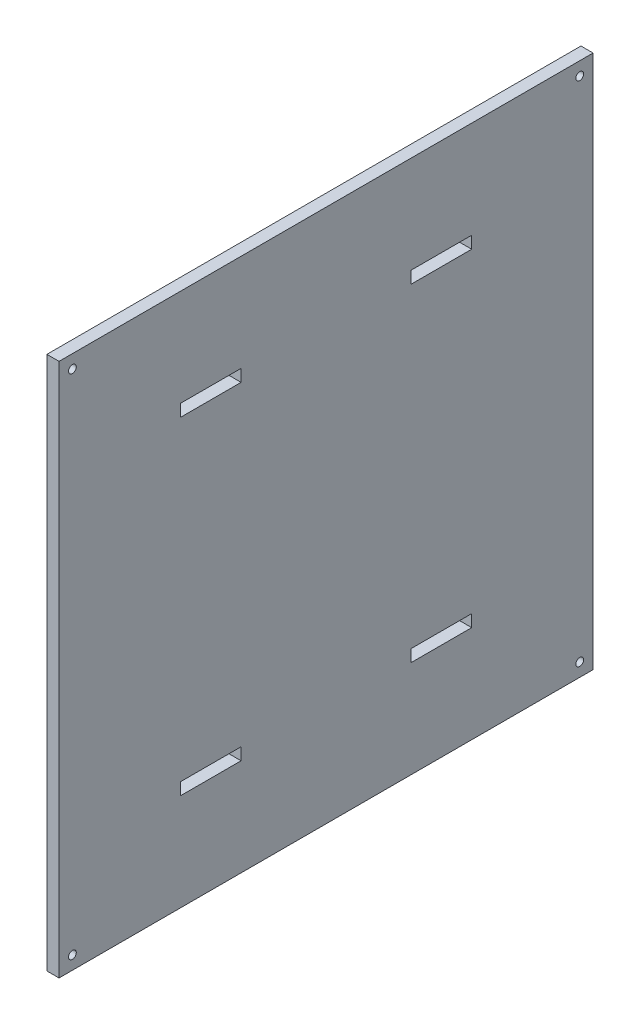
ISO-10303-21;
HEADER;
FILE_DESCRIPTION(('STEP AP214'),'2;1');
FILE_NAME('part.step','',(''),(''),'','','');
FILE_SCHEMA(('AUTOMOTIVE_DESIGN { 1 0 10303 214 1 1 1 1 }'));
ENDSEC;
DATA;
#1=APPLICATION_CONTEXT('core data for automotive mechanical design processes');
#2=APPLICATION_PROTOCOL_DEFINITION('international standard','automotive_design',2000,#1);
#3=PRODUCT_CONTEXT('',#1,'mechanical');
#4=PRODUCT('Part','Part','',(#3));
#5=PRODUCT_RELATED_PRODUCT_CATEGORY('part','',(#4));
#6=PRODUCT_DEFINITION_FORMATION('','',#4);
#7=PRODUCT_DEFINITION_CONTEXT('part definition',#1,'design');
#8=PRODUCT_DEFINITION('design','',#6,#7);
#9=PRODUCT_DEFINITION_SHAPE('','',#8);
#10=(LENGTH_UNIT() NAMED_UNIT(*) SI_UNIT(.MILLI.,.METRE.));
#11=(NAMED_UNIT(*) PLANE_ANGLE_UNIT() SI_UNIT($,.RADIAN.));
#12=(NAMED_UNIT(*) SI_UNIT($,.STERADIAN.) SOLID_ANGLE_UNIT());
#13=UNCERTAINTY_MEASURE_WITH_UNIT(LENGTH_MEASURE(1.E-05),#10,'distance_accuracy_value','');
#14=(GEOMETRIC_REPRESENTATION_CONTEXT(3) GLOBAL_UNCERTAINTY_ASSIGNED_CONTEXT((#13)) GLOBAL_UNIT_ASSIGNED_CONTEXT((#10,
#11,#12)) REPRESENTATION_CONTEXT('',''));
#15=CARTESIAN_POINT('',(0.,0.,0.));
#16=DIRECTION('',(0.,0.,1.));
#17=DIRECTION('',(1.,0.,0.));
#18=AXIS2_PLACEMENT_3D('',#15,#16,#17);
#19=CARTESIAN_POINT('',(5.,0.,0.));
#20=DIRECTION('',(1.,0.,0.));
#21=DIRECTION('',(0.,0.,-1.));
#22=AXIS2_PLACEMENT_3D('',#19,#20,#21);
#23=PLANE('',#22);
#24=CARTESIAN_POINT('',(5.,5.49999999999997,214.5));
#25=DIRECTION('',(1.,0.,0.));
#26=DIRECTION('',(0.,0.,-1.));
#27=AXIS2_PLACEMENT_3D('',#24,#25,#26);
#28=CIRCLE('',#27,1.59999999999999);
#29=CARTESIAN_POINT('',(5.,5.49999999999997,212.9));
#30=VERTEX_POINT('',#29);
#31=EDGE_CURVE('E575',#30,#30,#28,.T.);
#32=ORIENTED_EDGE('',*,*,#31,.F.);
#33=EDGE_LOOP('',(#32));
#34=FACE_BOUND('',#33,.T.);
#35=CARTESIAN_POINT('',(5.,214.5,214.5));
#36=DIRECTION('',(1.,0.,0.));
#37=DIRECTION('',(0.,0.,-1.));
#38=AXIS2_PLACEMENT_3D('',#35,#36,#37);
#39=CIRCLE('',#38,1.59999999999999);
#40=CARTESIAN_POINT('',(5.,214.5,212.9));
#41=VERTEX_POINT('',#40);
#42=EDGE_CURVE('E200',#41,#41,#39,.T.);
#43=ORIENTED_EDGE('',*,*,#42,.F.);
#44=EDGE_LOOP('',(#43));
#45=FACE_BOUND('',#44,.T.);
#46=DIRECTION('',(0.,1.,0.));
#47=VECTOR('',#46,1.);
#48=CARTESIAN_POINT('',(5.,0.,0.));
#49=LINE('',#48,#47);
#50=CARTESIAN_POINT('',(5.,0.,0.));
#51=VERTEX_POINT('',#50);
#52=CARTESIAN_POINT('',(5.,220.,0.));
#53=VERTEX_POINT('',#52);
#54=EDGE_CURVE('E303',#51,#53,#49,.T.);
#55=ORIENTED_EDGE('',*,*,#54,.T.);
#56=DIRECTION('',(0.,0.,1.));
#57=VECTOR('',#56,1.);
#58=CARTESIAN_POINT('',(5.,220.,0.));
#59=LINE('',#58,#57);
#60=CARTESIAN_POINT('',(5.,220.,220.));
#61=VERTEX_POINT('',#60);
#62=EDGE_CURVE('E306',#53,#61,#59,.T.);
#63=ORIENTED_EDGE('',*,*,#62,.T.);
#64=DIRECTION('',(0.,-1.,0.));
#65=VECTOR('',#64,1.);
#66=CARTESIAN_POINT('',(5.,0.,220.));
#67=LINE('',#66,#65);
#68=CARTESIAN_POINT('',(5.,0.,220.));
#69=VERTEX_POINT('',#68);
#70=EDGE_CURVE('E309',#61,#69,#67,.T.);
#71=ORIENTED_EDGE('',*,*,#70,.T.);
#72=DIRECTION('',(0.,0.,-1.));
#73=VECTOR('',#72,1.);
#74=CARTESIAN_POINT('',(5.,0.,0.));
#75=LINE('',#74,#73);
#76=EDGE_CURVE('E311',#69,#51,#75,.T.);
#77=ORIENTED_EDGE('',*,*,#76,.T.);
#78=EDGE_LOOP('',(#55,#63,#71,#77));
#79=FACE_BOUND('',#78,.T.);
#80=DIRECTION('',(0.,0.,-1.));
#81=VECTOR('',#80,1.);
#82=CARTESIAN_POINT('',(5.,40.,170.));
#83=LINE('',#82,#81);
#84=CARTESIAN_POINT('',(5.,40.,170.));
#85=VERTEX_POINT('',#84);
#86=CARTESIAN_POINT('',(5.,40.,145.));
#87=VERTEX_POINT('',#86);
#88=EDGE_CURVE('E274',#85,#87,#83,.T.);
#89=ORIENTED_EDGE('',*,*,#88,.F.);
#90=DIRECTION('',(0.,-1.,0.));
#91=VECTOR('',#90,1.);
#92=CARTESIAN_POINT('',(5.,44.9999999999999,170.));
#93=LINE('',#92,#91);
#94=CARTESIAN_POINT('',(5.,44.9999999999999,170.));
#95=VERTEX_POINT('',#94);
#96=EDGE_CURVE('E272',#95,#85,#93,.T.);
#97=ORIENTED_EDGE('',*,*,#96,.F.);
#98=DIRECTION('',(0.,0.,1.));
#99=VECTOR('',#98,1.);
#100=CARTESIAN_POINT('',(5.,44.9999999999999,170.));
#101=LINE('',#100,#99);
#102=CARTESIAN_POINT('',(5.,45.,145.));
#103=VERTEX_POINT('',#102);
#104=EDGE_CURVE('E280',#103,#95,#101,.T.);
#105=ORIENTED_EDGE('',*,*,#104,.F.);
#106=DIRECTION('',(0.,1.,0.));
#107=VECTOR('',#106,1.);
#108=CARTESIAN_POINT('',(5.,45.,145.));
#109=LINE('',#108,#107);
#110=EDGE_CURVE('E277',#87,#103,#109,.T.);
#111=ORIENTED_EDGE('',*,*,#110,.F.);
#112=EDGE_LOOP('',(#89,#97,#105,#111));
#113=FACE_BOUND('',#112,.T.);
#114=DIRECTION('',(0.,0.,-1.));
#115=VECTOR('',#114,1.);
#116=CARTESIAN_POINT('',(5.,40.,75.));
#117=LINE('',#116,#115);
#118=CARTESIAN_POINT('',(5.,40.,75.));
#119=VERTEX_POINT('',#118);
#120=CARTESIAN_POINT('',(5.,40.,50.));
#121=VERTEX_POINT('',#120);
#122=EDGE_CURVE('E243',#119,#121,#117,.T.);
#123=ORIENTED_EDGE('',*,*,#122,.F.);
#124=DIRECTION('',(0.,-1.,0.));
#125=VECTOR('',#124,1.);
#126=CARTESIAN_POINT('',(5.,45.,75.));
#127=LINE('',#126,#125);
#128=CARTESIAN_POINT('',(5.,45.,75.));
#129=VERTEX_POINT('',#128);
#130=EDGE_CURVE('E241',#129,#119,#127,.T.);
#131=ORIENTED_EDGE('',*,*,#130,.F.);
#132=DIRECTION('',(0.,0.,1.));
#133=VECTOR('',#132,1.);
#134=CARTESIAN_POINT('',(5.,45.,75.));
#135=LINE('',#134,#133);
#136=CARTESIAN_POINT('',(5.,45.,50.));
#137=VERTEX_POINT('',#136);
#138=EDGE_CURVE('E249',#137,#129,#135,.T.);
#139=ORIENTED_EDGE('',*,*,#138,.F.);
#140=DIRECTION('',(0.,1.,0.));
#141=VECTOR('',#140,1.);
#142=CARTESIAN_POINT('',(5.,45.,50.));
#143=LINE('',#142,#141);
#144=EDGE_CURVE('E246',#121,#137,#143,.T.);
#145=ORIENTED_EDGE('',*,*,#144,.F.);
#146=EDGE_LOOP('',(#123,#131,#139,#145));
#147=FACE_BOUND('',#146,.T.);
#148=DIRECTION('',(0.,0.,-1.));
#149=VECTOR('',#148,1.);
#150=CARTESIAN_POINT('',(5.,175.,170.));
#151=LINE('',#150,#149);
#152=CARTESIAN_POINT('',(5.,175.,170.));
#153=VERTEX_POINT('',#152);
#154=CARTESIAN_POINT('',(5.,175.,145.));
#155=VERTEX_POINT('',#154);
#156=EDGE_CURVE('E212',#153,#155,#151,.T.);
#157=ORIENTED_EDGE('',*,*,#156,.F.);
#158=DIRECTION('',(0.,-1.,0.));
#159=VECTOR('',#158,1.);
#160=CARTESIAN_POINT('',(5.,180.,170.));
#161=LINE('',#160,#159);
#162=CARTESIAN_POINT('',(5.,180.,170.));
#163=VERTEX_POINT('',#162);
#164=EDGE_CURVE('E210',#163,#153,#161,.T.);
#165=ORIENTED_EDGE('',*,*,#164,.F.);
#166=DIRECTION('',(0.,0.,1.));
#167=VECTOR('',#166,1.);
#168=CARTESIAN_POINT('',(5.,180.,170.));
#169=LINE('',#168,#167);
#170=CARTESIAN_POINT('',(5.,180.,145.));
#171=VERTEX_POINT('',#170);
#172=EDGE_CURVE('E218',#171,#163,#169,.T.);
#173=ORIENTED_EDGE('',*,*,#172,.F.);
#174=DIRECTION('',(0.,1.,0.));
#175=VECTOR('',#174,1.);
#176=CARTESIAN_POINT('',(5.,180.,145.));
#177=LINE('',#176,#175);
#178=EDGE_CURVE('E215',#155,#171,#177,.T.);
#179=ORIENTED_EDGE('',*,*,#178,.F.);
#180=EDGE_LOOP('',(#157,#165,#173,#179));
#181=FACE_BOUND('',#180,.T.);
#182=DIRECTION('',(0.,0.,-1.));
#183=VECTOR('',#182,1.);
#184=CARTESIAN_POINT('',(5.,175.,75.));
#185=LINE('',#184,#183);
#186=CARTESIAN_POINT('',(5.,175.,75.));
#187=VERTEX_POINT('',#186);
#188=CARTESIAN_POINT('',(5.,175.,50.));
#189=VERTEX_POINT('',#188);
#190=EDGE_CURVE('E179',#187,#189,#185,.T.);
#191=ORIENTED_EDGE('',*,*,#190,.F.);
#192=DIRECTION('',(0.,-1.,0.));
#193=VECTOR('',#192,1.);
#194=CARTESIAN_POINT('',(5.,180.,75.));
#195=LINE('',#194,#193);
#196=CARTESIAN_POINT('',(5.,180.,75.));
#197=VERTEX_POINT('',#196);
#198=EDGE_CURVE('E171',#197,#187,#195,.T.);
#199=ORIENTED_EDGE('',*,*,#198,.F.);
#200=DIRECTION('',(0.,0.,1.));
#201=VECTOR('',#200,1.);
#202=CARTESIAN_POINT('',(5.,180.,75.));
#203=LINE('',#202,#201);
#204=CARTESIAN_POINT('',(5.,180.,50.));
#205=VERTEX_POINT('',#204);
#206=EDGE_CURVE('E194',#205,#197,#203,.T.);
#207=ORIENTED_EDGE('',*,*,#206,.F.);
#208=DIRECTION('',(0.,1.,0.));
#209=VECTOR('',#208,1.);
#210=CARTESIAN_POINT('',(5.,180.,50.));
#211=LINE('',#210,#209);
#212=EDGE_CURVE('E192',#189,#205,#211,.T.);
#213=ORIENTED_EDGE('',*,*,#212,.F.);
#214=EDGE_LOOP('',(#191,#199,#207,#213));
#215=FACE_BOUND('',#214,.T.);
#216=CARTESIAN_POINT('',(5.,214.5,5.50000000000006));
#217=DIRECTION('',(1.,0.,0.));
#218=DIRECTION('',(0.,0.,-1.));
#219=AXIS2_PLACEMENT_3D('',#216,#217,#218);
#220=CIRCLE('',#219,1.59999999999999);
#221=CARTESIAN_POINT('',(5.,214.5,3.90000000000007));
#222=VERTEX_POINT('',#221);
#223=EDGE_CURVE('E581',#222,#222,#220,.T.);
#224=ORIENTED_EDGE('',*,*,#223,.F.);
#225=EDGE_LOOP('',(#224));
#226=FACE_BOUND('',#225,.T.);
#227=CARTESIAN_POINT('',(5.,5.50000000000002,5.50000000000001));
#228=DIRECTION('',(1.,0.,0.));
#229=DIRECTION('',(0.,0.,-1.));
#230=AXIS2_PLACEMENT_3D('',#227,#228,#229);
#231=CIRCLE('',#230,1.6);
#232=CARTESIAN_POINT('',(5.,5.50000000000002,3.9));
#233=VERTEX_POINT('',#232);
#234=EDGE_CURVE('E566',#233,#233,#231,.T.);
#235=ORIENTED_EDGE('',*,*,#234,.F.);
#236=EDGE_LOOP('',(#235));
#237=FACE_BOUND('',#236,.T.);
#238=ADVANCED_FACE('F34',(#34,#45,#79,#113,#147,#181,#215,#226,#237),#23,.T.);
#239=CARTESIAN_POINT('',(0.,0.,0.));
#240=DIRECTION('',(1.,0.,0.));
#241=DIRECTION('',(0.,0.,-1.));
#242=AXIS2_PLACEMENT_3D('',#239,#240,#241);
#243=PLANE('',#242);
#244=DIRECTION('',(0.,-1.,0.));
#245=VECTOR('',#244,1.);
#246=CARTESIAN_POINT('',(0.,180.,170.));
#247=LINE('',#246,#245);
#248=CARTESIAN_POINT('',(0.,180.,170.));
#249=VERTEX_POINT('',#248);
#250=CARTESIAN_POINT('',(0.,175.,170.));
#251=VERTEX_POINT('',#250);
#252=EDGE_CURVE('E187',#249,#251,#247,.T.);
#253=ORIENTED_EDGE('',*,*,#252,.T.);
#254=DIRECTION('',(0.,0.,-1.));
#255=VECTOR('',#254,1.);
#256=CARTESIAN_POINT('',(0.,175.,170.));
#257=LINE('',#256,#255);
#258=CARTESIAN_POINT('',(0.,175.,145.));
#259=VERTEX_POINT('',#258);
#260=EDGE_CURVE('E223',#251,#259,#257,.T.);
#261=ORIENTED_EDGE('',*,*,#260,.T.);
#262=DIRECTION('',(0.,1.,0.));
#263=VECTOR('',#262,1.);
#264=CARTESIAN_POINT('',(0.,180.,145.));
#265=LINE('',#264,#263);
#266=CARTESIAN_POINT('',(0.,180.,145.));
#267=VERTEX_POINT('',#266);
#268=EDGE_CURVE('E226',#259,#267,#265,.T.);
#269=ORIENTED_EDGE('',*,*,#268,.T.);
#270=DIRECTION('',(0.,0.,1.));
#271=VECTOR('',#270,1.);
#272=CARTESIAN_POINT('',(0.,180.,170.));
#273=LINE('',#272,#271);
#274=EDGE_CURVE('E213',#267,#249,#273,.T.);
#275=ORIENTED_EDGE('',*,*,#274,.T.);
#276=EDGE_LOOP('',(#253,#261,#269,#275));
#277=FACE_BOUND('',#276,.T.);
#278=DIRECTION('',(0.,-1.,0.));
#279=VECTOR('',#278,1.);
#280=CARTESIAN_POINT('',(0.,44.9999999999999,170.));
#281=LINE('',#280,#279);
#282=CARTESIAN_POINT('',(0.,44.9999999999999,170.));
#283=VERTEX_POINT('',#282);
#284=CARTESIAN_POINT('',(0.,40.,170.));
#285=VERTEX_POINT('',#284);
#286=EDGE_CURVE('E271',#283,#285,#281,.T.);
#287=ORIENTED_EDGE('',*,*,#286,.T.);
#288=DIRECTION('',(0.,0.,-1.));
#289=VECTOR('',#288,1.);
#290=CARTESIAN_POINT('',(0.,40.,170.));
#291=LINE('',#290,#289);
#292=CARTESIAN_POINT('',(0.,40.,145.));
#293=VERTEX_POINT('',#292);
#294=EDGE_CURVE('E285',#285,#293,#291,.T.);
#295=ORIENTED_EDGE('',*,*,#294,.T.);
#296=DIRECTION('',(0.,1.,0.));
#297=VECTOR('',#296,1.);
#298=CARTESIAN_POINT('',(0.,45.,145.));
#299=LINE('',#298,#297);
#300=CARTESIAN_POINT('',(0.,45.,145.));
#301=VERTEX_POINT('',#300);
#302=EDGE_CURVE('E288',#293,#301,#299,.T.);
#303=ORIENTED_EDGE('',*,*,#302,.T.);
#304=DIRECTION('',(0.,0.,1.));
#305=VECTOR('',#304,1.);
#306=CARTESIAN_POINT('',(0.,44.9999999999999,170.));
#307=LINE('',#306,#305);
#308=EDGE_CURVE('E275',#301,#283,#307,.T.);
#309=ORIENTED_EDGE('',*,*,#308,.T.);
#310=EDGE_LOOP('',(#287,#295,#303,#309));
#311=FACE_BOUND('',#310,.T.);
#312=DIRECTION('',(0.,1.,0.));
#313=VECTOR('',#312,1.);
#314=CARTESIAN_POINT('',(0.,0.,0.));
#315=LINE('',#314,#313);
#316=CARTESIAN_POINT('',(0.,0.,0.));
#317=VERTEX_POINT('',#316);
#318=CARTESIAN_POINT('',(0.,220.,0.));
#319=VERTEX_POINT('',#318);
#320=EDGE_CURVE('E302',#317,#319,#315,.T.);
#321=ORIENTED_EDGE('',*,*,#320,.F.);
#322=DIRECTION('',(0.,0.,-1.));
#323=VECTOR('',#322,1.);
#324=CARTESIAN_POINT('',(0.,0.,0.));
#325=LINE('',#324,#323);
#326=CARTESIAN_POINT('',(0.,0.,220.));
#327=VERTEX_POINT('',#326);
#328=EDGE_CURVE('E307',#327,#317,#325,.T.);
#329=ORIENTED_EDGE('',*,*,#328,.F.);
#330=DIRECTION('',(0.,-1.,0.));
#331=VECTOR('',#330,1.);
#332=CARTESIAN_POINT('',(0.,0.,220.));
#333=LINE('',#332,#331);
#334=CARTESIAN_POINT('',(0.,220.,220.));
#335=VERTEX_POINT('',#334);
#336=EDGE_CURVE('E318',#335,#327,#333,.T.);
#337=ORIENTED_EDGE('',*,*,#336,.F.);
#338=DIRECTION('',(0.,0.,1.));
#339=VECTOR('',#338,1.);
#340=CARTESIAN_POINT('',(0.,220.,0.));
#341=LINE('',#340,#339);
#342=EDGE_CURVE('E316',#319,#335,#341,.T.);
#343=ORIENTED_EDGE('',*,*,#342,.F.);
#344=EDGE_LOOP('',(#321,#329,#337,#343));
#345=FACE_BOUND('',#344,.T.);
#346=DIRECTION('',(0.,-1.,0.));
#347=VECTOR('',#346,1.);
#348=CARTESIAN_POINT('',(0.,45.,75.));
#349=LINE('',#348,#347);
#350=CARTESIAN_POINT('',(0.,45.,75.));
#351=VERTEX_POINT('',#350);
#352=CARTESIAN_POINT('',(0.,40.,75.));
#353=VERTEX_POINT('',#352);
#354=EDGE_CURVE('E240',#351,#353,#349,.T.);
#355=ORIENTED_EDGE('',*,*,#354,.T.);
#356=DIRECTION('',(0.,0.,-1.));
#357=VECTOR('',#356,1.);
#358=CARTESIAN_POINT('',(0.,40.,75.));
#359=LINE('',#358,#357);
#360=CARTESIAN_POINT('',(0.,40.,50.));
#361=VERTEX_POINT('',#360);
#362=EDGE_CURVE('E254',#353,#361,#359,.T.);
#363=ORIENTED_EDGE('',*,*,#362,.T.);
#364=DIRECTION('',(0.,1.,0.));
#365=VECTOR('',#364,1.);
#366=CARTESIAN_POINT('',(0.,45.,50.));
#367=LINE('',#366,#365);
#368=CARTESIAN_POINT('',(0.,45.,50.));
#369=VERTEX_POINT('',#368);
#370=EDGE_CURVE('E257',#361,#369,#367,.T.);
#371=ORIENTED_EDGE('',*,*,#370,.T.);
#372=DIRECTION('',(0.,0.,1.));
#373=VECTOR('',#372,1.);
#374=CARTESIAN_POINT('',(0.,45.,75.));
#375=LINE('',#374,#373);
#376=EDGE_CURVE('E244',#369,#351,#375,.T.);
#377=ORIENTED_EDGE('',*,*,#376,.T.);
#378=EDGE_LOOP('',(#355,#363,#371,#377));
#379=FACE_BOUND('',#378,.T.);
#380=DIRECTION('',(0.,-1.,0.));
#381=VECTOR('',#380,1.);
#382=CARTESIAN_POINT('',(0.,180.,75.));
#383=LINE('',#382,#381);
#384=CARTESIAN_POINT('',(0.,180.,75.));
#385=VERTEX_POINT('',#384);
#386=CARTESIAN_POINT('',(0.,175.,75.));
#387=VERTEX_POINT('',#386);
#388=EDGE_CURVE('E57',#385,#387,#383,.T.);
#389=ORIENTED_EDGE('',*,*,#388,.T.);
#390=DIRECTION('',(0.,0.,-1.));
#391=VECTOR('',#390,1.);
#392=CARTESIAN_POINT('',(0.,175.,75.));
#393=LINE('',#392,#391);
#394=CARTESIAN_POINT('',(0.,175.,50.));
#395=VERTEX_POINT('',#394);
#396=EDGE_CURVE('E186',#387,#395,#393,.T.);
#397=ORIENTED_EDGE('',*,*,#396,.T.);
#398=DIRECTION('',(0.,1.,0.));
#399=VECTOR('',#398,1.);
#400=CARTESIAN_POINT('',(0.,180.,50.));
#401=LINE('',#400,#399);
#402=CARTESIAN_POINT('',(0.,180.,50.));
#403=VERTEX_POINT('',#402);
#404=EDGE_CURVE('E202',#395,#403,#401,.T.);
#405=ORIENTED_EDGE('',*,*,#404,.T.);
#406=DIRECTION('',(0.,0.,1.));
#407=VECTOR('',#406,1.);
#408=CARTESIAN_POINT('',(0.,180.,75.));
#409=LINE('',#408,#407);
#410=EDGE_CURVE('E180',#403,#385,#409,.T.);
#411=ORIENTED_EDGE('',*,*,#410,.T.);
#412=EDGE_LOOP('',(#389,#397,#405,#411));
#413=FACE_BOUND('',#412,.T.);
#414=CARTESIAN_POINT('',(0.,214.5,214.5));
#415=DIRECTION('',(1.,0.,0.));
#416=DIRECTION('',(0.,0.,-1.));
#417=AXIS2_PLACEMENT_3D('',#414,#415,#416);
#418=CIRCLE('',#417,1.59999999999999);
#419=CARTESIAN_POINT('',(0.,214.5,212.9));
#420=VERTEX_POINT('',#419);
#421=EDGE_CURVE('E584',#420,#420,#418,.T.);
#422=ORIENTED_EDGE('',*,*,#421,.T.);
#423=EDGE_LOOP('',(#422));
#424=FACE_BOUND('',#423,.T.);
#425=CARTESIAN_POINT('',(0.,214.5,5.50000000000006));
#426=DIRECTION('',(1.,0.,0.));
#427=DIRECTION('',(0.,0.,-1.));
#428=AXIS2_PLACEMENT_3D('',#425,#426,#427);
#429=CIRCLE('',#428,1.59999999999999);
#430=CARTESIAN_POINT('',(0.,214.5,3.90000000000007));
#431=VERTEX_POINT('',#430);
#432=EDGE_CURVE('E578',#431,#431,#429,.T.);
#433=ORIENTED_EDGE('',*,*,#432,.T.);
#434=EDGE_LOOP('',(#433));
#435=FACE_BOUND('',#434,.T.);
#436=CARTESIAN_POINT('',(0.,5.49999999999997,214.5));
#437=DIRECTION('',(1.,0.,0.));
#438=DIRECTION('',(0.,0.,-1.));
#439=AXIS2_PLACEMENT_3D('',#436,#437,#438);
#440=CIRCLE('',#439,1.59999999999999);
#441=CARTESIAN_POINT('',(0.,5.49999999999997,212.9));
#442=VERTEX_POINT('',#441);
#443=EDGE_CURVE('E572',#442,#442,#440,.T.);
#444=ORIENTED_EDGE('',*,*,#443,.T.);
#445=EDGE_LOOP('',(#444));
#446=FACE_BOUND('',#445,.T.);
#447=CARTESIAN_POINT('',(0.,5.50000000000002,5.50000000000001));
#448=DIRECTION('',(1.,0.,0.));
#449=DIRECTION('',(0.,0.,-1.));
#450=AXIS2_PLACEMENT_3D('',#447,#448,#449);
#451=CIRCLE('',#450,1.6);
#452=CARTESIAN_POINT('',(0.,5.50000000000002,3.9));
#453=VERTEX_POINT('',#452);
#454=EDGE_CURVE('E569',#453,#453,#451,.T.);
#455=ORIENTED_EDGE('',*,*,#454,.T.);
#456=EDGE_LOOP('',(#455));
#457=FACE_BOUND('',#456,.T.);
#458=ADVANCED_FACE('F336',(#277,#311,#345,#379,#413,#424,#435,#446,#457),#243,.F.);
#459=CARTESIAN_POINT('',(5.,0.,0.));
#460=DIRECTION('',(0.,0.,1.));
#461=DIRECTION('',(1.,0.,0.));
#462=AXIS2_PLACEMENT_3D('',#459,#460,#461);
#463=PLANE('',#462);
#464=ORIENTED_EDGE('',*,*,#320,.T.);
#465=DIRECTION('',(-1.,0.,0.));
#466=VECTOR('',#465,1.);
#467=CARTESIAN_POINT('',(5.,220.,0.));
#468=LINE('',#467,#466);
#469=EDGE_CURVE('E11',#53,#319,#468,.T.);
#470=ORIENTED_EDGE('',*,*,#469,.F.);
#471=ORIENTED_EDGE('',*,*,#54,.F.);
#472=DIRECTION('',(-1.,0.,0.));
#473=VECTOR('',#472,1.);
#474=CARTESIAN_POINT('',(5.,0.,0.));
#475=LINE('',#474,#473);
#476=EDGE_CURVE('E313',#51,#317,#475,.T.);
#477=ORIENTED_EDGE('',*,*,#476,.T.);
#478=EDGE_LOOP('',(#464,#470,#471,#477));
#479=FACE_BOUND('',#478,.T.);
#480=ADVANCED_FACE('F36',(#479),#463,.F.);
#481=CARTESIAN_POINT('',(5.,220.,0.));
#482=DIRECTION('',(0.,-1.,0.));
#483=DIRECTION('',(0.,0.,-1.));
#484=AXIS2_PLACEMENT_3D('',#481,#482,#483);
#485=PLANE('',#484);
#486=ORIENTED_EDGE('',*,*,#342,.T.);
#487=DIRECTION('',(-1.,0.,0.));
#488=VECTOR('',#487,1.);
#489=CARTESIAN_POINT('',(5.,220.,220.));
#490=LINE('',#489,#488);
#491=EDGE_CURVE('E42',#61,#335,#490,.T.);
#492=ORIENTED_EDGE('',*,*,#491,.F.);
#493=ORIENTED_EDGE('',*,*,#62,.F.);
#494=ORIENTED_EDGE('',*,*,#469,.T.);
#495=EDGE_LOOP('',(#486,#492,#493,#494));
#496=FACE_BOUND('',#495,.T.);
#497=ADVANCED_FACE('F347',(#496),#485,.F.);
#498=CARTESIAN_POINT('',(5.,0.,220.));
#499=DIRECTION('',(0.,0.,-1.));
#500=DIRECTION('',(-1.,0.,0.));
#501=AXIS2_PLACEMENT_3D('',#498,#499,#500);
#502=PLANE('',#501);
#503=ORIENTED_EDGE('',*,*,#336,.T.);
#504=DIRECTION('',(-1.,0.,0.));
#505=VECTOR('',#504,1.);
#506=CARTESIAN_POINT('',(5.,0.,220.));
#507=LINE('',#506,#505);
#508=EDGE_CURVE('E323',#69,#327,#507,.T.);
#509=ORIENTED_EDGE('',*,*,#508,.F.);
#510=ORIENTED_EDGE('',*,*,#70,.F.);
#511=ORIENTED_EDGE('',*,*,#491,.T.);
#512=EDGE_LOOP('',(#503,#509,#510,#511));
#513=FACE_BOUND('',#512,.T.);
#514=ADVANCED_FACE('F330',(#513),#502,.F.);
#515=CARTESIAN_POINT('',(5.,0.,0.));
#516=DIRECTION('',(0.,1.,0.));
#517=DIRECTION('',(0.,0.,1.));
#518=AXIS2_PLACEMENT_3D('',#515,#516,#517);
#519=PLANE('',#518);
#520=ORIENTED_EDGE('',*,*,#328,.T.);
#521=ORIENTED_EDGE('',*,*,#476,.F.);
#522=ORIENTED_EDGE('',*,*,#76,.F.);
#523=ORIENTED_EDGE('',*,*,#508,.T.);
#524=EDGE_LOOP('',(#520,#521,#522,#523));
#525=FACE_BOUND('',#524,.T.);
#526=ADVANCED_FACE('F340',(#525),#519,.F.);
#527=CARTESIAN_POINT('',(5.,44.9999999999999,170.));
#528=DIRECTION('',(0.,0.,-1.));
#529=DIRECTION('',(-1.,0.,0.));
#530=AXIS2_PLACEMENT_3D('',#527,#528,#529);
#531=PLANE('',#530);
#532=ORIENTED_EDGE('',*,*,#286,.F.);
#533=DIRECTION('',(-1.,0.,0.));
#534=VECTOR('',#533,1.);
#535=CARTESIAN_POINT('',(5.,44.9999999999999,170.));
#536=LINE('',#535,#534);
#537=EDGE_CURVE('E282',#95,#283,#536,.T.);
#538=ORIENTED_EDGE('',*,*,#537,.F.);
#539=ORIENTED_EDGE('',*,*,#96,.T.);
#540=DIRECTION('',(-1.,0.,0.));
#541=VECTOR('',#540,1.);
#542=CARTESIAN_POINT('',(5.,40.,170.));
#543=LINE('',#542,#541);
#544=EDGE_CURVE('E299',#85,#285,#543,.T.);
#545=ORIENTED_EDGE('',*,*,#544,.T.);
#546=EDGE_LOOP('',(#532,#538,#539,#545));
#547=FACE_BOUND('',#546,.T.);
#548=ADVANCED_FACE('F365',(#547),#531,.T.);
#549=CARTESIAN_POINT('',(5.,40.,170.));
#550=DIRECTION('',(0.,1.,0.));
#551=DIRECTION('',(0.,0.,1.));
#552=AXIS2_PLACEMENT_3D('',#549,#550,#551);
#553=PLANE('',#552);
#554=ORIENTED_EDGE('',*,*,#294,.F.);
#555=ORIENTED_EDGE('',*,*,#544,.F.);
#556=ORIENTED_EDGE('',*,*,#88,.T.);
#557=DIRECTION('',(-1.,0.,0.));
#558=VECTOR('',#557,1.);
#559=CARTESIAN_POINT('',(5.,40.,145.));
#560=LINE('',#559,#558);
#561=EDGE_CURVE('E297',#87,#293,#560,.T.);
#562=ORIENTED_EDGE('',*,*,#561,.T.);
#563=EDGE_LOOP('',(#554,#555,#556,#562));
#564=FACE_BOUND('',#563,.T.);
#565=ADVANCED_FACE('F372',(#564),#553,.T.);
#566=CARTESIAN_POINT('',(5.,45.,145.));
#567=DIRECTION('',(0.,0.,1.));
#568=DIRECTION('',(1.,0.,0.));
#569=AXIS2_PLACEMENT_3D('',#566,#567,#568);
#570=PLANE('',#569);
#571=ORIENTED_EDGE('',*,*,#302,.F.);
#572=ORIENTED_EDGE('',*,*,#561,.F.);
#573=ORIENTED_EDGE('',*,*,#110,.T.);
#574=DIRECTION('',(-1.,0.,0.));
#575=VECTOR('',#574,1.);
#576=CARTESIAN_POINT('',(5.,45.,145.));
#577=LINE('',#576,#575);
#578=EDGE_CURVE('E295',#103,#301,#577,.T.);
#579=ORIENTED_EDGE('',*,*,#578,.T.);
#580=EDGE_LOOP('',(#571,#572,#573,#579));
#581=FACE_BOUND('',#580,.T.);
#582=ADVANCED_FACE('F377',(#581),#570,.T.);
#583=CARTESIAN_POINT('',(5.,44.9999999999999,170.));
#584=DIRECTION('',(0.,-1.,0.));
#585=DIRECTION('',(0.,0.,-1.));
#586=AXIS2_PLACEMENT_3D('',#583,#584,#585);
#587=PLANE('',#586);
#588=ORIENTED_EDGE('',*,*,#308,.F.);
#589=ORIENTED_EDGE('',*,*,#578,.F.);
#590=ORIENTED_EDGE('',*,*,#104,.T.);
#591=ORIENTED_EDGE('',*,*,#537,.T.);
#592=EDGE_LOOP('',(#588,#589,#590,#591));
#593=FACE_BOUND('',#592,.T.);
#594=ADVANCED_FACE('F385',(#593),#587,.T.);
#595=CARTESIAN_POINT('',(5.,45.,75.));
#596=DIRECTION('',(0.,0.,-1.));
#597=DIRECTION('',(-1.,0.,0.));
#598=AXIS2_PLACEMENT_3D('',#595,#596,#597);
#599=PLANE('',#598);
#600=ORIENTED_EDGE('',*,*,#354,.F.);
#601=DIRECTION('',(-1.,0.,0.));
#602=VECTOR('',#601,1.);
#603=CARTESIAN_POINT('',(5.,45.,75.));
#604=LINE('',#603,#602);
#605=EDGE_CURVE('E251',#129,#351,#604,.T.);
#606=ORIENTED_EDGE('',*,*,#605,.F.);
#607=ORIENTED_EDGE('',*,*,#130,.T.);
#608=DIRECTION('',(-1.,0.,0.));
#609=VECTOR('',#608,1.);
#610=CARTESIAN_POINT('',(5.,40.,75.));
#611=LINE('',#610,#609);
#612=EDGE_CURVE('E268',#119,#353,#611,.T.);
#613=ORIENTED_EDGE('',*,*,#612,.T.);
#614=EDGE_LOOP('',(#600,#606,#607,#613));
#615=FACE_BOUND('',#614,.T.);
#616=ADVANCED_FACE('F439',(#615),#599,.T.);
#617=CARTESIAN_POINT('',(5.,40.,75.));
#618=DIRECTION('',(0.,1.,0.));
#619=DIRECTION('',(0.,0.,1.));
#620=AXIS2_PLACEMENT_3D('',#617,#618,#619);
#621=PLANE('',#620);
#622=ORIENTED_EDGE('',*,*,#362,.F.);
#623=ORIENTED_EDGE('',*,*,#612,.F.);
#624=ORIENTED_EDGE('',*,*,#122,.T.);
#625=DIRECTION('',(-1.,0.,0.));
#626=VECTOR('',#625,1.);
#627=CARTESIAN_POINT('',(5.,40.,50.));
#628=LINE('',#627,#626);
#629=EDGE_CURVE('E266',#121,#361,#628,.T.);
#630=ORIENTED_EDGE('',*,*,#629,.T.);
#631=EDGE_LOOP('',(#622,#623,#624,#630));
#632=FACE_BOUND('',#631,.T.);
#633=ADVANCED_FACE('F435',(#632),#621,.T.);
#634=CARTESIAN_POINT('',(5.,45.,50.));
#635=DIRECTION('',(0.,0.,1.));
#636=DIRECTION('',(1.,0.,0.));
#637=AXIS2_PLACEMENT_3D('',#634,#635,#636);
#638=PLANE('',#637);
#639=ORIENTED_EDGE('',*,*,#370,.F.);
#640=ORIENTED_EDGE('',*,*,#629,.F.);
#641=ORIENTED_EDGE('',*,*,#144,.T.);
#642=DIRECTION('',(-1.,0.,0.));
#643=VECTOR('',#642,1.);
#644=CARTESIAN_POINT('',(5.,45.,50.));
#645=LINE('',#644,#643);
#646=EDGE_CURVE('E264',#137,#369,#645,.T.);
#647=ORIENTED_EDGE('',*,*,#646,.T.);
#648=EDGE_LOOP('',(#639,#640,#641,#647));
#649=FACE_BOUND('',#648,.T.);
#650=ADVANCED_FACE('F431',(#649),#638,.T.);
#651=CARTESIAN_POINT('',(5.,45.,75.));
#652=DIRECTION('',(0.,-1.,0.));
#653=DIRECTION('',(0.,0.,-1.));
#654=AXIS2_PLACEMENT_3D('',#651,#652,#653);
#655=PLANE('',#654);
#656=ORIENTED_EDGE('',*,*,#376,.F.);
#657=ORIENTED_EDGE('',*,*,#646,.F.);
#658=ORIENTED_EDGE('',*,*,#138,.T.);
#659=ORIENTED_EDGE('',*,*,#605,.T.);
#660=EDGE_LOOP('',(#656,#657,#658,#659));
#661=FACE_BOUND('',#660,.T.);
#662=ADVANCED_FACE('F428',(#661),#655,.T.);
#663=CARTESIAN_POINT('',(5.,180.,170.));
#664=DIRECTION('',(0.,0.,-1.));
#665=DIRECTION('',(-1.,0.,0.));
#666=AXIS2_PLACEMENT_3D('',#663,#664,#665);
#667=PLANE('',#666);
#668=ORIENTED_EDGE('',*,*,#252,.F.);
#669=DIRECTION('',(-1.,0.,0.));
#670=VECTOR('',#669,1.);
#671=CARTESIAN_POINT('',(5.,180.,170.));
#672=LINE('',#671,#670);
#673=EDGE_CURVE('E220',#163,#249,#672,.T.);
#674=ORIENTED_EDGE('',*,*,#673,.F.);
#675=ORIENTED_EDGE('',*,*,#164,.T.);
#676=DIRECTION('',(-1.,0.,0.));
#677=VECTOR('',#676,1.);
#678=CARTESIAN_POINT('',(5.,175.,170.));
#679=LINE('',#678,#677);
#680=EDGE_CURVE('E237',#153,#251,#679,.T.);
#681=ORIENTED_EDGE('',*,*,#680,.T.);
#682=EDGE_LOOP('',(#668,#674,#675,#681));
#683=FACE_BOUND('',#682,.T.);
#684=ADVANCED_FACE('F410',(#683),#667,.T.);
#685=CARTESIAN_POINT('',(5.,175.,170.));
#686=DIRECTION('',(0.,1.,0.));
#687=DIRECTION('',(0.,0.,1.));
#688=AXIS2_PLACEMENT_3D('',#685,#686,#687);
#689=PLANE('',#688);
#690=ORIENTED_EDGE('',*,*,#260,.F.);
#691=ORIENTED_EDGE('',*,*,#680,.F.);
#692=ORIENTED_EDGE('',*,*,#156,.T.);
#693=DIRECTION('',(-1.,0.,0.));
#694=VECTOR('',#693,1.);
#695=CARTESIAN_POINT('',(5.,175.,145.));
#696=LINE('',#695,#694);
#697=EDGE_CURVE('E235',#155,#259,#696,.T.);
#698=ORIENTED_EDGE('',*,*,#697,.T.);
#699=EDGE_LOOP('',(#690,#691,#692,#698));
#700=FACE_BOUND('',#699,.T.);
#701=ADVANCED_FACE('F404',(#700),#689,.T.);
#702=CARTESIAN_POINT('',(5.,180.,145.));
#703=DIRECTION('',(0.,0.,1.));
#704=DIRECTION('',(1.,0.,0.));
#705=AXIS2_PLACEMENT_3D('',#702,#703,#704);
#706=PLANE('',#705);
#707=ORIENTED_EDGE('',*,*,#268,.F.);
#708=ORIENTED_EDGE('',*,*,#697,.F.);
#709=ORIENTED_EDGE('',*,*,#178,.T.);
#710=DIRECTION('',(-1.,0.,0.));
#711=VECTOR('',#710,1.);
#712=CARTESIAN_POINT('',(5.,180.,145.));
#713=LINE('',#712,#711);
#714=EDGE_CURVE('E233',#171,#267,#713,.T.);
#715=ORIENTED_EDGE('',*,*,#714,.T.);
#716=EDGE_LOOP('',(#707,#708,#709,#715));
#717=FACE_BOUND('',#716,.T.);
#718=ADVANCED_FACE('F407',(#717),#706,.T.);
#719=CARTESIAN_POINT('',(5.,180.,170.));
#720=DIRECTION('',(0.,-1.,0.));
#721=DIRECTION('',(0.,0.,-1.));
#722=AXIS2_PLACEMENT_3D('',#719,#720,#721);
#723=PLANE('',#722);
#724=ORIENTED_EDGE('',*,*,#274,.F.);
#725=ORIENTED_EDGE('',*,*,#714,.F.);
#726=ORIENTED_EDGE('',*,*,#172,.T.);
#727=ORIENTED_EDGE('',*,*,#673,.T.);
#728=EDGE_LOOP('',(#724,#725,#726,#727));
#729=FACE_BOUND('',#728,.T.);
#730=ADVANCED_FACE('F413',(#729),#723,.T.);
#731=CARTESIAN_POINT('',(5.,180.,75.));
#732=DIRECTION('',(0.,0.,-1.));
#733=DIRECTION('',(0.,1.,0.));
#734=AXIS2_PLACEMENT_3D('',#731,#732,#733);
#735=PLANE('',#734);
#736=ORIENTED_EDGE('',*,*,#388,.F.);
#737=DIRECTION('',(-1.,0.,0.));
#738=VECTOR('',#737,1.);
#739=CARTESIAN_POINT('',(5.,180.,75.));
#740=LINE('',#739,#738);
#741=EDGE_CURVE('E175',#197,#385,#740,.T.);
#742=ORIENTED_EDGE('',*,*,#741,.F.);
#743=ORIENTED_EDGE('',*,*,#198,.T.);
#744=DIRECTION('',(-1.,0.,0.));
#745=VECTOR('',#744,1.);
#746=CARTESIAN_POINT('',(5.,175.,75.));
#747=LINE('',#746,#745);
#748=EDGE_CURVE('E174',#187,#387,#747,.T.);
#749=ORIENTED_EDGE('',*,*,#748,.T.);
#750=EDGE_LOOP('',(#736,#742,#743,#749));
#751=FACE_BOUND('',#750,.T.);
#752=ADVANCED_FACE('F173',(#751),#735,.T.);
#753=CARTESIAN_POINT('',(5.,175.,75.));
#754=DIRECTION('',(0.,1.,0.));
#755=DIRECTION('',(0.,0.,1.));
#756=AXIS2_PLACEMENT_3D('',#753,#754,#755);
#757=PLANE('',#756);
#758=ORIENTED_EDGE('',*,*,#396,.F.);
#759=ORIENTED_EDGE('',*,*,#748,.F.);
#760=ORIENTED_EDGE('',*,*,#190,.T.);
#761=DIRECTION('',(-1.,0.,0.));
#762=VECTOR('',#761,1.);
#763=CARTESIAN_POINT('',(5.,175.,50.));
#764=LINE('',#763,#762);
#765=EDGE_CURVE('E188',#189,#395,#764,.T.);
#766=ORIENTED_EDGE('',*,*,#765,.T.);
#767=EDGE_LOOP('',(#758,#759,#760,#766));
#768=FACE_BOUND('',#767,.T.);
#769=ADVANCED_FACE('F183',(#768),#757,.T.);
#770=CARTESIAN_POINT('',(5.,180.,50.));
#771=DIRECTION('',(0.,0.,1.));
#772=DIRECTION('',(1.,0.,0.));
#773=AXIS2_PLACEMENT_3D('',#770,#771,#772);
#774=PLANE('',#773);
#775=ORIENTED_EDGE('',*,*,#404,.F.);
#776=ORIENTED_EDGE('',*,*,#765,.F.);
#777=ORIENTED_EDGE('',*,*,#212,.T.);
#778=DIRECTION('',(-1.,0.,0.));
#779=VECTOR('',#778,1.);
#780=CARTESIAN_POINT('',(5.,180.,50.));
#781=LINE('',#780,#779);
#782=EDGE_CURVE('E49',#205,#403,#781,.T.);
#783=ORIENTED_EDGE('',*,*,#782,.T.);
#784=EDGE_LOOP('',(#775,#776,#777,#783));
#785=FACE_BOUND('',#784,.T.);
#786=ADVANCED_FACE('F502',(#785),#774,.T.);
#787=CARTESIAN_POINT('',(5.,180.,75.));
#788=DIRECTION('',(0.,-1.,0.));
#789=DIRECTION('',(0.,0.,-1.));
#790=AXIS2_PLACEMENT_3D('',#787,#788,#789);
#791=PLANE('',#790);
#792=ORIENTED_EDGE('',*,*,#410,.F.);
#793=ORIENTED_EDGE('',*,*,#782,.F.);
#794=ORIENTED_EDGE('',*,*,#206,.T.);
#795=ORIENTED_EDGE('',*,*,#741,.T.);
#796=EDGE_LOOP('',(#792,#793,#794,#795));
#797=FACE_BOUND('',#796,.T.);
#798=ADVANCED_FACE('F510',(#797),#791,.T.);
#799=CARTESIAN_POINT('',(5.,214.5,214.5));
#800=DIRECTION('',(-1.,0.,0.));
#801=DIRECTION('',(0.,0.,1.));
#802=AXIS2_PLACEMENT_3D('',#799,#800,#801);
#803=CYLINDRICAL_SURFACE('',#802,1.59999999999999);
#804=ORIENTED_EDGE('',*,*,#42,.T.);
#805=EDGE_LOOP('',(#804));
#806=FACE_BOUND('',#805,.T.);
#807=ORIENTED_EDGE('',*,*,#421,.F.);
#808=EDGE_LOOP('',(#807));
#809=FACE_BOUND('',#808,.T.);
#810=ADVANCED_FACE('F520',(#806,#809),#803,.F.);
#811=CARTESIAN_POINT('',(5.,214.5,5.50000000000006));
#812=DIRECTION('',(-1.,0.,0.));
#813=DIRECTION('',(0.,0.,1.));
#814=AXIS2_PLACEMENT_3D('',#811,#812,#813);
#815=CYLINDRICAL_SURFACE('',#814,1.59999999999999);
#816=ORIENTED_EDGE('',*,*,#223,.T.);
#817=EDGE_LOOP('',(#816));
#818=FACE_BOUND('',#817,.T.);
#819=ORIENTED_EDGE('',*,*,#432,.F.);
#820=EDGE_LOOP('',(#819));
#821=FACE_BOUND('',#820,.T.);
#822=ADVANCED_FACE('F529',(#818,#821),#815,.F.);
#823=CARTESIAN_POINT('',(5.,5.49999999999997,214.5));
#824=DIRECTION('',(-1.,0.,0.));
#825=DIRECTION('',(0.,0.,1.));
#826=AXIS2_PLACEMENT_3D('',#823,#824,#825);
#827=CYLINDRICAL_SURFACE('',#826,1.59999999999999);
#828=ORIENTED_EDGE('',*,*,#31,.T.);
#829=EDGE_LOOP('',(#828));
#830=FACE_BOUND('',#829,.T.);
#831=ORIENTED_EDGE('',*,*,#443,.F.);
#832=EDGE_LOOP('',(#831));
#833=FACE_BOUND('',#832,.T.);
#834=ADVANCED_FACE('F539',(#830,#833),#827,.F.);
#835=CARTESIAN_POINT('',(5.,5.50000000000002,5.50000000000001));
#836=DIRECTION('',(-1.,0.,0.));
#837=DIRECTION('',(0.,0.,1.));
#838=AXIS2_PLACEMENT_3D('',#835,#836,#837);
#839=CYLINDRICAL_SURFACE('',#838,1.6);
#840=ORIENTED_EDGE('',*,*,#234,.T.);
#841=EDGE_LOOP('',(#840));
#842=FACE_BOUND('',#841,.T.);
#843=ORIENTED_EDGE('',*,*,#454,.F.);
#844=EDGE_LOOP('',(#843));
#845=FACE_BOUND('',#844,.T.);
#846=ADVANCED_FACE('F549',(#842,#845),#839,.F.);
#847=CLOSED_SHELL('',(#238,#458,#480,#497,#514,#526,#548,#565,#582,#594,#616,#633,#650,#662,
#684,#701,#718,#730,#752,#769,#786,#798,#810,#822,#834,#846));
#848=MANIFOLD_SOLID_BREP('B2',#847);
#849=ADVANCED_BREP_SHAPE_REPRESENTATION('',(#18,#848),#14);
#850=SHAPE_DEFINITION_REPRESENTATION(#9,#849);
ENDSEC;
END-ISO-10303-21;
